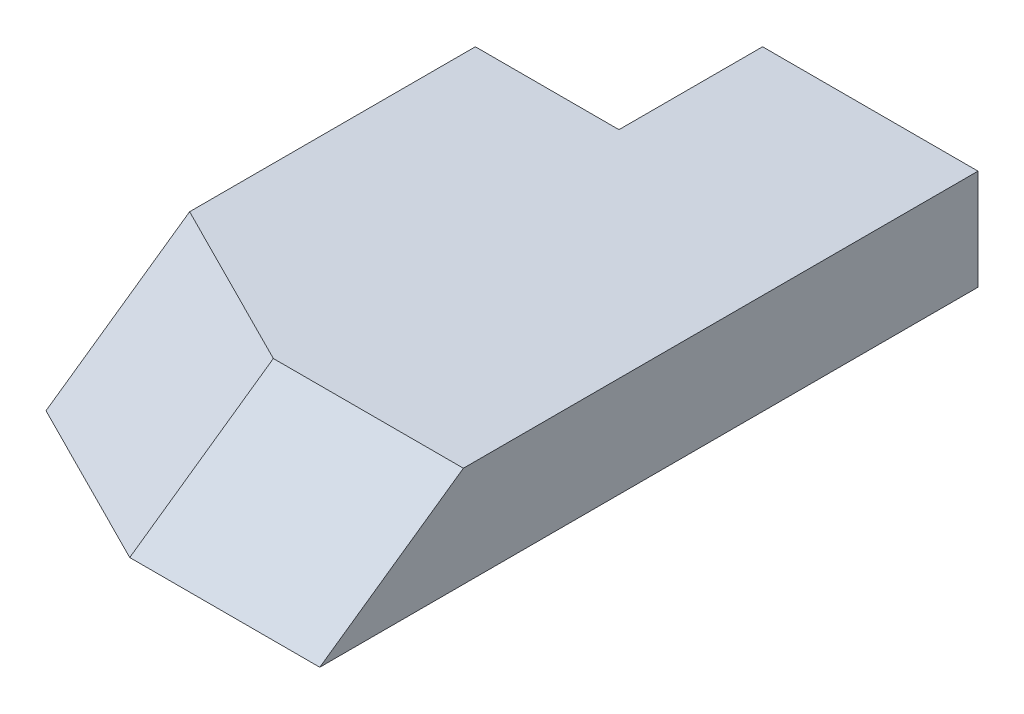
ISO-10303-21;
HEADER;
FILE_DESCRIPTION(('STEP AP214'),'2;1');
FILE_NAME('part.step','',(''),(''),'','','');
FILE_SCHEMA(('AUTOMOTIVE_DESIGN { 1 0 10303 214 1 1 1 1 }'));
ENDSEC;
DATA;
#1=APPLICATION_CONTEXT('core data for automotive mechanical design processes');
#2=APPLICATION_PROTOCOL_DEFINITION('international standard','automotive_design',2000,#1);
#3=PRODUCT_CONTEXT('',#1,'mechanical');
#4=PRODUCT('Part','Part','',(#3));
#5=PRODUCT_RELATED_PRODUCT_CATEGORY('part','',(#4));
#6=PRODUCT_DEFINITION_FORMATION('','',#4);
#7=PRODUCT_DEFINITION_CONTEXT('part definition',#1,'design');
#8=PRODUCT_DEFINITION('design','',#6,#7);
#9=PRODUCT_DEFINITION_SHAPE('','',#8);
#10=(LENGTH_UNIT() NAMED_UNIT(*) SI_UNIT(.MILLI.,.METRE.));
#11=(NAMED_UNIT(*) PLANE_ANGLE_UNIT() SI_UNIT($,.RADIAN.));
#12=(NAMED_UNIT(*) SI_UNIT($,.STERADIAN.) SOLID_ANGLE_UNIT());
#13=UNCERTAINTY_MEASURE_WITH_UNIT(LENGTH_MEASURE(1.E-05),#10,'distance_accuracy_value','');
#14=(GEOMETRIC_REPRESENTATION_CONTEXT(3) GLOBAL_UNCERTAINTY_ASSIGNED_CONTEXT((#13)) GLOBAL_UNIT_ASSIGNED_CONTEXT((#10,
#11,#12)) REPRESENTATION_CONTEXT('',''));
#15=CARTESIAN_POINT('',(0.,0.,0.));
#16=DIRECTION('',(0.,0.,1.));
#17=DIRECTION('',(1.,0.,0.));
#18=AXIS2_PLACEMENT_3D('',#15,#16,#17);
#19=CARTESIAN_POINT('',(15.,-7.,28.));
#20=DIRECTION('',(0.,-1.,0.));
#21=DIRECTION('',(0.,0.,-1.));
#22=AXIS2_PLACEMENT_3D('',#19,#20,#21);
#23=PLANE('',#22);
#24=DIRECTION('',(0.,0.,1.));
#25=VECTOR('',#24,1.);
#26=CARTESIAN_POINT('',(-3.,-7.,28.));
#27=LINE('',#26,#25);
#28=CARTESIAN_POINT('',(-3.,-7.,-15.));
#29=VERTEX_POINT('',#28);
#30=CARTESIAN_POINT('',(-3.,-7.,-3.));
#31=VERTEX_POINT('',#30);
#32=EDGE_CURVE('E47',#29,#31,#27,.T.);
#33=ORIENTED_EDGE('',*,*,#32,.T.);
#34=DIRECTION('',(-1.,0.,0.));
#35=VECTOR('',#34,1.);
#36=CARTESIAN_POINT('',(15.,-7.,-3.));
#37=LINE('',#36,#35);
#38=CARTESIAN_POINT('',(-15.,-7.,-3.));
#39=VERTEX_POINT('',#38);
#40=EDGE_CURVE('E136',#31,#39,#37,.T.);
#41=ORIENTED_EDGE('',*,*,#40,.T.);
#42=DIRECTION('',(0.,0.,1.));
#43=VECTOR('',#42,1.);
#44=CARTESIAN_POINT('',(-15.,-7.,28.));
#45=LINE('',#44,#43);
#46=CARTESIAN_POINT('',(-15.,-7.,20.8767519996608));
#47=VERTEX_POINT('',#46);
#48=EDGE_CURVE('E54',#39,#47,#45,.T.);
#49=ORIENTED_EDGE('',*,*,#48,.T.);
#50=DIRECTION('',(-0.892821775015855,0.,-0.450410122063811));
#51=VECTOR('',#50,1.);
#52=CARTESIAN_POINT('',(11.7784358644463,-7.,34.385919118898));
#53=LINE('',#52,#51);
#54=CARTESIAN_POINT('',(-0.880000000000006,-7.,28.));
#55=VERTEX_POINT('',#54);
#56=EDGE_CURVE('E131',#55,#47,#53,.T.);
#57=ORIENTED_EDGE('',*,*,#56,.F.);
#58=DIRECTION('',(-1.,0.,0.));
#59=VECTOR('',#58,1.);
#60=CARTESIAN_POINT('',(15.,-7.,28.));
#61=LINE('',#60,#59);
#62=CARTESIAN_POINT('',(15.,-7.,28.));
#63=VERTEX_POINT('',#62);
#64=EDGE_CURVE('E114',#63,#55,#61,.T.);
#65=ORIENTED_EDGE('',*,*,#64,.F.);
#66=DIRECTION('',(0.,0.,1.));
#67=VECTOR('',#66,1.);
#68=CARTESIAN_POINT('',(15.,-7.,28.));
#69=LINE('',#68,#67);
#70=CARTESIAN_POINT('',(15.,-7.,-15.));
#71=VERTEX_POINT('',#70);
#72=EDGE_CURVE('E141',#71,#63,#69,.T.);
#73=ORIENTED_EDGE('',*,*,#72,.F.);
#74=DIRECTION('',(-1.,0.,0.));
#75=VECTOR('',#74,1.);
#76=CARTESIAN_POINT('',(15.,-7.,-15.));
#77=LINE('',#76,#75);
#78=EDGE_CURVE('E124',#71,#29,#77,.T.);
#79=ORIENTED_EDGE('',*,*,#78,.T.);
#80=EDGE_LOOP('',(#33,#41,#49,#57,#65,#73,#79));
#81=FACE_BOUND('',#80,.T.);
#82=ADVANCED_FACE('F32',(#81),#23,.F.);
#83=CARTESIAN_POINT('',(15.,-7.,28.));
#84=DIRECTION('',(0.,-0.819152044288995,-0.573576436351041));
#85=DIRECTION('',(0.,0.573576436351042,-0.819152044288995));
#86=AXIS2_PLACEMENT_3D('',#83,#84,#85);
#87=PLANE('',#86);
#88=DIRECTION('',(0.,0.573576436351042,-0.819152044288995));
#89=VECTOR('',#88,1.);
#90=CARTESIAN_POINT('',(-0.880000000000006,-6.99999999999999,28.));
#91=LINE('',#90,#89);
#92=CARTESIAN_POINT('',(-0.880000000000004,-15.4024904585164,40.));
#93=VERTEX_POINT('',#92);
#94=EDGE_CURVE('E135',#93,#55,#91,.T.);
#95=ORIENTED_EDGE('',*,*,#94,.F.);
#96=DIRECTION('',(-1.,0.,0.));
#97=VECTOR('',#96,1.);
#98=CARTESIAN_POINT('',(15.,-15.4024904585164,40.));
#99=LINE('',#98,#97);
#100=CARTESIAN_POINT('',(15.,-15.4024904585164,40.));
#101=VERTEX_POINT('',#100);
#102=EDGE_CURVE('E110',#101,#93,#99,.T.);
#103=ORIENTED_EDGE('',*,*,#102,.F.);
#104=DIRECTION('',(0.,-0.573576436351041,0.819152044288995));
#105=VECTOR('',#104,1.);
#106=CARTESIAN_POINT('',(15.,-7.,28.));
#107=LINE('',#106,#105);
#108=EDGE_CURVE('E116',#63,#101,#107,.T.);
#109=ORIENTED_EDGE('',*,*,#108,.F.);
#110=ORIENTED_EDGE('',*,*,#64,.T.);
#111=EDGE_LOOP('',(#95,#103,#109,#110));
#112=FACE_BOUND('',#111,.T.);
#113=ADVANCED_FACE('F160',(#112),#87,.F.);
#114=CARTESIAN_POINT('',(15.,-15.4024904585164,40.));
#115=DIRECTION('',(0.,1.,0.));
#116=DIRECTION('',(0.,0.,1.));
#117=AXIS2_PLACEMENT_3D('',#114,#115,#116);
#118=PLANE('',#117);
#119=DIRECTION('',(0.,0.,-1.));
#120=VECTOR('',#119,1.);
#121=CARTESIAN_POINT('',(-15.,-15.4024904585164,40.));
#122=LINE('',#121,#120);
#123=CARTESIAN_POINT('',(-15.,-15.4024904585164,32.8767519996608));
#124=VERTEX_POINT('',#123);
#125=CARTESIAN_POINT('',(-15.,-15.4024904585164,-3.));
#126=VERTEX_POINT('',#125);
#127=EDGE_CURVE('E119',#124,#126,#122,.T.);
#128=ORIENTED_EDGE('',*,*,#127,.T.);
#129=DIRECTION('',(-1.,0.,0.));
#130=VECTOR('',#129,1.);
#131=CARTESIAN_POINT('',(-15.,-15.4024904585164,-3.));
#132=LINE('',#131,#130);
#133=CARTESIAN_POINT('',(-3.,-15.4024904585164,-3.));
#134=VERTEX_POINT('',#133);
#135=EDGE_CURVE('E106',#134,#126,#132,.T.);
#136=ORIENTED_EDGE('',*,*,#135,.F.);
#137=DIRECTION('',(0.,0.,1.));
#138=VECTOR('',#137,1.);
#139=CARTESIAN_POINT('',(-3.,-15.4024904585164,-3.));
#140=LINE('',#139,#138);
#141=CARTESIAN_POINT('',(-3.,-15.4024904585164,-15.));
#142=VERTEX_POINT('',#141);
#143=EDGE_CURVE('E93',#142,#134,#140,.T.);
#144=ORIENTED_EDGE('',*,*,#143,.F.);
#145=DIRECTION('',(-1.,0.,0.));
#146=VECTOR('',#145,1.);
#147=CARTESIAN_POINT('',(15.,-15.4024904585164,-15.));
#148=LINE('',#147,#146);
#149=CARTESIAN_POINT('',(15.,-15.4024904585164,-15.));
#150=VERTEX_POINT('',#149);
#151=EDGE_CURVE('E104',#150,#142,#148,.T.);
#152=ORIENTED_EDGE('',*,*,#151,.F.);
#153=DIRECTION('',(0.,0.,-1.));
#154=VECTOR('',#153,1.);
#155=CARTESIAN_POINT('',(15.,-15.4024904585164,40.));
#156=LINE('',#155,#154);
#157=EDGE_CURVE('E111',#101,#150,#156,.T.);
#158=ORIENTED_EDGE('',*,*,#157,.F.);
#159=ORIENTED_EDGE('',*,*,#102,.T.);
#160=DIRECTION('',(0.892821775015855,0.,0.450410122063811));
#161=VECTOR('',#160,1.);
#162=CARTESIAN_POINT('',(11.7784358644463,-15.4024904585164,46.385919118898));
#163=LINE('',#162,#161);
#164=EDGE_CURVE('E129',#124,#93,#163,.T.);
#165=ORIENTED_EDGE('',*,*,#164,.F.);
#166=EDGE_LOOP('',(#128,#136,#144,#152,#158,#159,#165));
#167=FACE_BOUND('',#166,.T.);
#168=ADVANCED_FACE('F102',(#167),#118,.F.);
#169=CARTESIAN_POINT('',(-15.,0.,0.));
#170=DIRECTION('',(1.,0.,0.));
#171=DIRECTION('',(0.,0.,-1.));
#172=AXIS2_PLACEMENT_3D('',#169,#170,#171);
#173=PLANE('',#172);
#174=ORIENTED_EDGE('',*,*,#48,.F.);
#175=DIRECTION('',(0.,-1.,0.));
#176=VECTOR('',#175,1.);
#177=CARTESIAN_POINT('',(-15.,-5.40249045851642,-3.));
#178=LINE('',#177,#176);
#179=EDGE_CURVE('E140',#39,#126,#178,.T.);
#180=ORIENTED_EDGE('',*,*,#179,.T.);
#181=ORIENTED_EDGE('',*,*,#127,.F.);
#182=DIRECTION('',(0.,-0.573576436351041,0.819152044288995));
#183=VECTOR('',#182,1.);
#184=CARTESIAN_POINT('',(-15.,5.11179439838942,3.5793169715304));
#185=LINE('',#184,#183);
#186=EDGE_CURVE('E40',#47,#124,#185,.T.);
#187=ORIENTED_EDGE('',*,*,#186,.F.);
#188=EDGE_LOOP('',(#174,#180,#181,#187));
#189=FACE_BOUND('',#188,.T.);
#190=ADVANCED_FACE('F139',(#189),#173,.F.);
#191=CARTESIAN_POINT('',(15.,-7.,-15.));
#192=DIRECTION('',(0.,0.,1.));
#193=DIRECTION('',(0.,-1.,0.));
#194=AXIS2_PLACEMENT_3D('',#191,#192,#193);
#195=PLANE('',#194);
#196=ORIENTED_EDGE('',*,*,#151,.T.);
#197=DIRECTION('',(0.,1.,0.));
#198=VECTOR('',#197,1.);
#199=CARTESIAN_POINT('',(-3.,-7.,-15.));
#200=LINE('',#199,#198);
#201=EDGE_CURVE('E11',#142,#29,#200,.T.);
#202=ORIENTED_EDGE('',*,*,#201,.T.);
#203=ORIENTED_EDGE('',*,*,#78,.F.);
#204=DIRECTION('',(0.,1.,0.));
#205=VECTOR('',#204,1.);
#206=CARTESIAN_POINT('',(15.,-7.,-15.));
#207=LINE('',#206,#205);
#208=EDGE_CURVE('E109',#150,#71,#207,.T.);
#209=ORIENTED_EDGE('',*,*,#208,.F.);
#210=EDGE_LOOP('',(#196,#202,#203,#209));
#211=FACE_BOUND('',#210,.T.);
#212=ADVANCED_FACE('F34',(#211),#195,.F.);
#213=CARTESIAN_POINT('',(15.,0.,0.));
#214=DIRECTION('',(1.,0.,0.));
#215=DIRECTION('',(0.,0.,-1.));
#216=AXIS2_PLACEMENT_3D('',#213,#214,#215);
#217=PLANE('',#216);
#218=ORIENTED_EDGE('',*,*,#208,.T.);
#219=ORIENTED_EDGE('',*,*,#72,.T.);
#220=ORIENTED_EDGE('',*,*,#108,.T.);
#221=ORIENTED_EDGE('',*,*,#157,.T.);
#222=EDGE_LOOP('',(#218,#219,#220,#221));
#223=FACE_BOUND('',#222,.T.);
#224=ADVANCED_FACE('F158',(#223),#217,.T.);
#225=CARTESIAN_POINT('',(-2.82507064215021,7.99759047683889,5.59997313939671));
#226=DIRECTION('',(-0.277955054295062,0.786872604901476,0.550974129562718));
#227=DIRECTION('',(0.,-0.573576436351041,0.819152044288995));
#228=AXIS2_PLACEMENT_3D('',#225,#226,#227);
#229=PLANE('',#228);
#230=ORIENTED_EDGE('',*,*,#56,.T.);
#231=ORIENTED_EDGE('',*,*,#186,.T.);
#232=ORIENTED_EDGE('',*,*,#164,.T.);
#233=ORIENTED_EDGE('',*,*,#94,.T.);
#234=EDGE_LOOP('',(#230,#231,#232,#233));
#235=FACE_BOUND('',#234,.T.);
#236=ADVANCED_FACE('F128',(#235),#229,.T.);
#237=CARTESIAN_POINT('',(-15.,-5.40249045851642,-3.));
#238=DIRECTION('',(0.,0.,1.));
#239=DIRECTION('',(1.,0.,0.));
#240=AXIS2_PLACEMENT_3D('',#237,#238,#239);
#241=PLANE('',#240);
#242=DIRECTION('',(0.,-1.,0.));
#243=VECTOR('',#242,1.);
#244=CARTESIAN_POINT('',(-3.,-5.40249045851642,-3.));
#245=LINE('',#244,#243);
#246=EDGE_CURVE('E150',#31,#134,#245,.T.);
#247=ORIENTED_EDGE('',*,*,#246,.T.);
#248=ORIENTED_EDGE('',*,*,#135,.T.);
#249=ORIENTED_EDGE('',*,*,#179,.F.);
#250=ORIENTED_EDGE('',*,*,#40,.F.);
#251=EDGE_LOOP('',(#247,#248,#249,#250));
#252=FACE_BOUND('',#251,.T.);
#253=ADVANCED_FACE('F154',(#252),#241,.F.);
#254=CARTESIAN_POINT('',(-3.,-5.40249045851642,-3.));
#255=DIRECTION('',(1.,0.,0.));
#256=DIRECTION('',(0.,0.,-1.));
#257=AXIS2_PLACEMENT_3D('',#254,#255,#256);
#258=PLANE('',#257);
#259=ORIENTED_EDGE('',*,*,#201,.F.);
#260=ORIENTED_EDGE('',*,*,#143,.T.);
#261=ORIENTED_EDGE('',*,*,#246,.F.);
#262=ORIENTED_EDGE('',*,*,#32,.F.);
#263=EDGE_LOOP('',(#259,#260,#261,#262));
#264=FACE_BOUND('',#263,.T.);
#265=ADVANCED_FACE('F92',(#264),#258,.F.);
#266=CLOSED_SHELL('',(#82,#113,#168,#190,#212,#224,#236,#253,#265));
#267=MANIFOLD_SOLID_BREP('B2',#266);
#268=ADVANCED_BREP_SHAPE_REPRESENTATION('',(#18,#267),#14);
#269=SHAPE_DEFINITION_REPRESENTATION(#9,#268);
ENDSEC;
END-ISO-10303-21;
